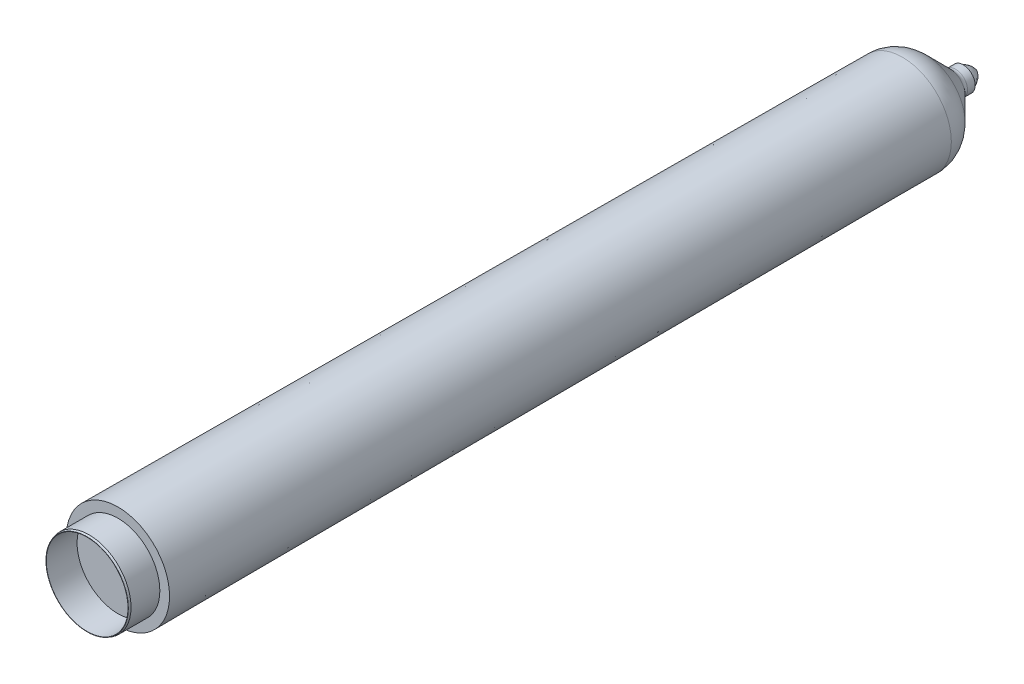
ISO-10303-21;
HEADER;
FILE_DESCRIPTION(('STEP AP214'),'2;1');
FILE_NAME('part.step','',(''),(''),'','','');
FILE_SCHEMA(('AUTOMOTIVE_DESIGN { 1 0 10303 214 1 1 1 1 }'));
ENDSEC;
DATA;
#1=APPLICATION_CONTEXT('core data for automotive mechanical design processes');
#2=APPLICATION_PROTOCOL_DEFINITION('international standard','automotive_design',2000,#1);
#3=PRODUCT_CONTEXT('',#1,'mechanical');
#4=PRODUCT('Part','Part','',(#3));
#5=PRODUCT_RELATED_PRODUCT_CATEGORY('part','',(#4));
#6=PRODUCT_DEFINITION_FORMATION('','',#4);
#7=PRODUCT_DEFINITION_CONTEXT('part definition',#1,'design');
#8=PRODUCT_DEFINITION('design','',#6,#7);
#9=PRODUCT_DEFINITION_SHAPE('','',#8);
#10=(LENGTH_UNIT() NAMED_UNIT(*) SI_UNIT(.MILLI.,.METRE.));
#11=(NAMED_UNIT(*) PLANE_ANGLE_UNIT() SI_UNIT($,.RADIAN.));
#12=(NAMED_UNIT(*) SI_UNIT($,.STERADIAN.) SOLID_ANGLE_UNIT());
#13=UNCERTAINTY_MEASURE_WITH_UNIT(LENGTH_MEASURE(1.E-05),#10,'distance_accuracy_value','');
#14=(GEOMETRIC_REPRESENTATION_CONTEXT(3) GLOBAL_UNCERTAINTY_ASSIGNED_CONTEXT((#13)) GLOBAL_UNIT_ASSIGNED_CONTEXT((#10,
#11,#12)) REPRESENTATION_CONTEXT('',''));
#15=CARTESIAN_POINT('',(0.,0.,0.));
#16=DIRECTION('',(0.,0.,1.));
#17=DIRECTION('',(1.,0.,0.));
#18=AXIS2_PLACEMENT_3D('',#15,#16,#17);
#19=CARTESIAN_POINT('',(0.,0.,-126.14));
#20=DIRECTION('',(0.,0.,1.));
#21=DIRECTION('',(1.,0.,0.));
#22=AXIS2_PLACEMENT_3D('',#19,#20,#21);
#23=PLANE('',#22);
#24=CARTESIAN_POINT('',(0.,0.,-126.14));
#25=DIRECTION('',(0.,0.,-1.));
#26=DIRECTION('',(-1.,0.,0.));
#27=AXIS2_PLACEMENT_3D('',#24,#25,#26);
#28=CIRCLE('',#27,1.57989692160063);
#29=CARTESIAN_POINT('',(-1.57989692160063,0.,-126.14));
#30=VERTEX_POINT('',#29);
#31=EDGE_CURVE('E12',#30,#30,#28,.T.);
#32=ORIENTED_EDGE('',*,*,#31,.F.);
#33=EDGE_LOOP('',(#32));
#34=FACE_BOUND('',#33,.T.);
#35=ADVANCED_FACE('F49',(#34),#23,.T.);
#36=CARTESIAN_POINT('',(1.34120346941098,0.,-125.456499812998));
#37=DIRECTION('',(0.,-1.,0.));
#38=DIRECTION('',(-1.,0.,0.));
#39=AXIS2_PLACEMENT_3D('',#36,#37,#38);
#40=CIRCLE('',#39,3.);
#41=TRIMMED_CURVE('',#40,(PARAMETER_VALUE(-1.10731168961127)),
(PARAMETER_VALUE(1.10731168961127)),.T.,.PARAMETER.);
#42=CARTESIAN_POINT('',(0.,0.,-125.456499812998));
#43=DIRECTION('',(0.,0.,-1.));
#44=AXIS1_PLACEMENT('',#42,#43);
#45=SURFACE_OF_REVOLUTION('',#41,#44);
#46=ORIENTED_EDGE('',*,*,#31,.T.);
#47=EDGE_LOOP('',(#46));
#48=FACE_BOUND('',#47,.T.);
#49=CARTESIAN_POINT('',(0.,0.,-128.14));
#50=VERTEX_POINT('',#49);
#51=VERTEX_LOOP('',#50);
#52=FACE_BOUND('',#51,.T.);
#53=ADVANCED_FACE('F56',(#48,#52),#45,.T.);
#54=CLOSED_SHELL('',(#35,#53));
#55=MANIFOLD_SOLID_BREP('B2',#54);
#56=CARTESIAN_POINT('',(0.,0.,0.));
#57=DIRECTION('',(0.,0.,1.));
#58=DIRECTION('',(1.,0.,0.));
#59=AXIS2_PLACEMENT_3D('',#56,#57,#58);
#60=CONICAL_SURFACE('',#59,7.7,0.00349065850398867);
#61=CARTESIAN_POINT('',(0.,0.,-117.074097526226));
#62=DIRECTION('',(0.,0.,-1.));
#63=DIRECTION('',(0.,1.,0.));
#64=AXIS2_PLACEMENT_3D('',#61,#62,#63);
#65=CIRCLE('',#64,7.29133264604267);
#66=CARTESIAN_POINT('',(0.,7.29133264604267,-117.074097526226));
#67=VERTEX_POINT('',#66);
#68=EDGE_CURVE('E88',#67,#67,#65,.F.);
#69=ORIENTED_EDGE('',*,*,#68,.T.);
#70=EDGE_LOOP('',(#69));
#71=FACE_BOUND('',#70,.T.);
#72=CARTESIAN_POINT('',(0.,0.,0.));
#73=DIRECTION('',(0.,0.,1.));
#74=DIRECTION('',(1.,0.,0.));
#75=AXIS2_PLACEMENT_3D('',#72,#73,#74);
#76=CIRCLE('',#75,7.7);
#77=CARTESIAN_POINT('',(7.7,0.,0.));
#78=VERTEX_POINT('',#77);
#79=EDGE_CURVE('E110',#78,#78,#76,.T.);
#80=ORIENTED_EDGE('',*,*,#79,.F.);
#81=EDGE_LOOP('',(#80));
#82=FACE_BOUND('',#81,.T.);
#83=ADVANCED_FACE('F81',(#71,#82),#60,.T.);
#84=CARTESIAN_POINT('',(0.,0.,0.));
#85=DIRECTION('',(0.,0.,1.));
#86=DIRECTION('',(1.,0.,0.));
#87=AXIS2_PLACEMENT_3D('',#84,#85,#86);
#88=PLANE('',#87);
#89=CARTESIAN_POINT('',(0.,0.,0.));
#90=DIRECTION('',(0.,0.,1.));
#91=DIRECTION('',(1.,0.,0.));
#92=AXIS2_PLACEMENT_3D('',#89,#90,#91);
#93=CIRCLE('',#92,6.25);
#94=CARTESIAN_POINT('',(6.25,0.,0.));
#95=VERTEX_POINT('',#94);
#96=EDGE_CURVE('E113',#95,#95,#93,.T.);
#97=ORIENTED_EDGE('',*,*,#96,.F.);
#98=EDGE_LOOP('',(#97));
#99=FACE_BOUND('',#98,.T.);
#100=ORIENTED_EDGE('',*,*,#79,.T.);
#101=EDGE_LOOP('',(#100));
#102=FACE_BOUND('',#101,.T.);
#103=ADVANCED_FACE('F149',(#99,#102),#88,.T.);
#104=CARTESIAN_POINT('',(0.,0.,4.6));
#105=DIRECTION('',(0.,0.,1.));
#106=DIRECTION('',(1.,0.,0.));
#107=AXIS2_PLACEMENT_3D('',#104,#105,#106);
#108=PLANE('',#107);
#109=CARTESIAN_POINT('',(0.,0.,4.6));
#110=DIRECTION('',(0.,0.,1.));
#111=DIRECTION('',(1.,0.,0.));
#112=AXIS2_PLACEMENT_3D('',#109,#110,#111);
#113=CIRCLE('',#112,6.15000000000003);
#114=CARTESIAN_POINT('',(6.15000000000003,0.,4.6));
#115=VERTEX_POINT('',#114);
#116=EDGE_CURVE('E104',#115,#115,#113,.T.);
#117=ORIENTED_EDGE('',*,*,#116,.T.);
#118=EDGE_LOOP('',(#117));
#119=FACE_BOUND('',#118,.T.);
#120=CARTESIAN_POINT('',(0.,0.,4.6));
#121=DIRECTION('',(0.,0.,1.));
#122=DIRECTION('',(1.,0.,0.));
#123=AXIS2_PLACEMENT_3D('',#120,#121,#122);
#124=CIRCLE('',#123,6.1);
#125=CARTESIAN_POINT('',(6.1,0.,4.6));
#126=VERTEX_POINT('',#125);
#127=EDGE_CURVE('E116',#126,#126,#124,.T.);
#128=ORIENTED_EDGE('',*,*,#127,.F.);
#129=EDGE_LOOP('',(#128));
#130=FACE_BOUND('',#129,.T.);
#131=ADVANCED_FACE('F154',(#119,#130),#108,.T.);
#132=CARTESIAN_POINT('',(0.,0.,4.6));
#133=DIRECTION('',(0.,0.,-1.));
#134=DIRECTION('',(-1.,0.,0.));
#135=AXIS2_PLACEMENT_3D('',#132,#133,#134);
#136=CYLINDRICAL_SURFACE('',#135,6.25);
#137=CARTESIAN_POINT('',(0.,0.,4.30000000000011));
#138=DIRECTION('',(0.,0.,1.));
#139=DIRECTION('',(1.,0.,0.));
#140=AXIS2_PLACEMENT_3D('',#137,#138,#139);
#141=CIRCLE('',#140,6.25);
#142=CARTESIAN_POINT('',(6.25,0.,4.30000000000011));
#143=VERTEX_POINT('',#142);
#144=EDGE_CURVE('E101',#143,#143,#141,.F.);
#145=ORIENTED_EDGE('',*,*,#144,.T.);
#146=EDGE_LOOP('',(#145));
#147=FACE_BOUND('',#146,.T.);
#148=ORIENTED_EDGE('',*,*,#96,.T.);
#149=EDGE_LOOP('',(#148));
#150=FACE_BOUND('',#149,.T.);
#151=ADVANCED_FACE('F232',(#147,#150),#136,.T.);
#152=CARTESIAN_POINT('',(0.,0.,4.6));
#153=DIRECTION('',(0.,0.,-1.));
#154=DIRECTION('',(-1.,0.,0.));
#155=AXIS2_PLACEMENT_3D('',#152,#153,#154);
#156=CYLINDRICAL_SURFACE('',#155,6.1);
#157=ORIENTED_EDGE('',*,*,#127,.T.);
#158=EDGE_LOOP('',(#157));
#159=FACE_BOUND('',#158,.T.);
#160=CARTESIAN_POINT('',(0.,0.,0.));
#161=DIRECTION('',(0.,0.,1.));
#162=DIRECTION('',(1.,0.,0.));
#163=AXIS2_PLACEMENT_3D('',#160,#161,#162);
#164=CIRCLE('',#163,6.1);
#165=CARTESIAN_POINT('',(6.1,0.,0.));
#166=VERTEX_POINT('',#165);
#167=EDGE_CURVE('E107',#166,#166,#164,.F.);
#168=ORIENTED_EDGE('',*,*,#167,.T.);
#169=EDGE_LOOP('',(#168));
#170=FACE_BOUND('',#169,.T.);
#171=ADVANCED_FACE('F237',(#159,#170),#156,.F.);
#172=ORIENTED_EDGE('',*,*,#167,.F.);
#173=EDGE_LOOP('',(#172));
#174=FACE_BOUND('',#173,.T.);
#175=ADVANCED_FACE('F156',(#174),#88,.T.);
#176=CARTESIAN_POINT('',(0.,0.,4.6));
#177=DIRECTION('',(0.,0.,-1.));
#178=DIRECTION('',(-1.,0.,0.));
#179=AXIS2_PLACEMENT_3D('',#176,#177,#178);
#180=CONICAL_SURFACE('',#179,6.15000000000003,0.321750554396658);
#181=ORIENTED_EDGE('',*,*,#144,.F.);
#182=EDGE_LOOP('',(#181));
#183=FACE_BOUND('',#182,.T.);
#184=ORIENTED_EDGE('',*,*,#116,.F.);
#185=EDGE_LOOP('',(#184));
#186=FACE_BOUND('',#185,.T.);
#187=ADVANCED_FACE('F143',(#183,#186),#180,.T.);
#188=CARTESIAN_POINT('',(0.,0.,-124.14));
#189=DIRECTION('',(0.,0.,1.));
#190=DIRECTION('',(0.,-1.,0.));
#191=AXIS2_PLACEMENT_3D('',#188,#189,#190);
#192=CYLINDRICAL_SURFACE('',#191,1.77989692160063);
#193=CARTESIAN_POINT('',(0.,0.,-124.998263849908));
#194=DIRECTION('',(0.,0.,1.));
#195=DIRECTION('',(0.,-1.,0.));
#196=AXIS2_PLACEMENT_3D('',#193,#194,#195);
#197=CIRCLE('',#196,1.77989692160063);
#198=CARTESIAN_POINT('',(0.,-1.77989692160063,-124.998263849908));
#199=VERTEX_POINT('',#198);
#200=EDGE_CURVE('E92',#199,#199,#197,.F.);
#201=ORIENTED_EDGE('',*,*,#200,.T.);
#202=EDGE_LOOP('',(#201));
#203=FACE_BOUND('',#202,.T.);
#204=CARTESIAN_POINT('',(0.,0.,-126.14));
#205=DIRECTION('',(0.,0.,1.));
#206=DIRECTION('',(0.,-1.,0.));
#207=AXIS2_PLACEMENT_3D('',#204,#205,#206);
#208=CIRCLE('',#207,1.77989692160063);
#209=CARTESIAN_POINT('',(0.,-1.77989692160063,-126.14));
#210=VERTEX_POINT('',#209);
#211=EDGE_CURVE('E125',#210,#210,#208,.T.);
#212=ORIENTED_EDGE('',*,*,#211,.T.);
#213=EDGE_LOOP('',(#212));
#214=FACE_BOUND('',#213,.T.);
#215=ADVANCED_FACE('F129',(#203,#214),#192,.T.);
#216=CARTESIAN_POINT('',(0.,0.,-126.14));
#217=DIRECTION('',(0.,0.,1.));
#218=DIRECTION('',(1.,0.,0.));
#219=AXIS2_PLACEMENT_3D('',#216,#217,#218);
#220=PLANE('',#219);
#221=CARTESIAN_POINT('',(0.,0.,-126.14));
#222=DIRECTION('',(0.,0.,1.));
#223=DIRECTION('',(0.,-1.,0.));
#224=AXIS2_PLACEMENT_3D('',#221,#222,#223);
#225=CIRCLE('',#224,1.57989692160063);
#226=CARTESIAN_POINT('',(0.,-1.57989692160063,-126.14));
#227=VERTEX_POINT('',#226);
#228=EDGE_CURVE('E119',#227,#227,#225,.T.);
#229=ORIENTED_EDGE('',*,*,#228,.T.);
#230=EDGE_LOOP('',(#229));
#231=FACE_BOUND('',#230,.T.);
#232=ORIENTED_EDGE('',*,*,#211,.F.);
#233=EDGE_LOOP('',(#232));
#234=FACE_BOUND('',#233,.T.);
#235=ADVANCED_FACE('F131',(#231,#234),#220,.F.);
#236=CARTESIAN_POINT('',(0.,0.,-124.14));
#237=DIRECTION('',(0.,0.,1.));
#238=DIRECTION('',(0.,-1.,0.));
#239=AXIS2_PLACEMENT_3D('',#236,#237,#238);
#240=CYLINDRICAL_SURFACE('',#239,1.57989692160063);
#241=CARTESIAN_POINT('',(0.,0.,-124.14));
#242=DIRECTION('',(0.,0.,1.));
#243=DIRECTION('',(0.,-1.,0.));
#244=AXIS2_PLACEMENT_3D('',#241,#242,#243);
#245=CIRCLE('',#244,1.57989692160063);
#246=CARTESIAN_POINT('',(0.,-1.57989692160063,-124.14));
#247=VERTEX_POINT('',#246);
#248=EDGE_CURVE('E122',#247,#247,#245,.T.);
#249=ORIENTED_EDGE('',*,*,#248,.T.);
#250=EDGE_LOOP('',(#249));
#251=FACE_BOUND('',#250,.T.);
#252=ORIENTED_EDGE('',*,*,#228,.F.);
#253=EDGE_LOOP('',(#252));
#254=FACE_BOUND('',#253,.T.);
#255=ADVANCED_FACE('F133',(#251,#254),#240,.F.);
#256=CARTESIAN_POINT('',(0.,0.,-124.14));
#257=DIRECTION('',(0.,0.,-1.));
#258=DIRECTION('',(0.,1.,0.));
#259=AXIS2_PLACEMENT_3D('',#256,#257,#258);
#260=PLANE('',#259);
#261=ORIENTED_EDGE('',*,*,#248,.F.);
#262=EDGE_LOOP('',(#261));
#263=FACE_BOUND('',#262,.T.);
#264=ADVANCED_FACE('F140',(#263),#260,.T.);
#265=CARTESIAN_POINT('',(0.,0.,-119.140042646395));
#266=DIRECTION('',(0.,0.,1.));
#267=DIRECTION('',(0.,-1.,0.));
#268=AXIS2_PLACEMENT_3D('',#265,#266,#267);
#269=CONICAL_SURFACE('',#268,7.28412110785001,0.787143492649446);
#270=CARTESIAN_POINT('',(0.,0.,-120.598343457773));
#271=DIRECTION('',(0.,0.,-1.));
#272=DIRECTION('',(0.,1.,0.));
#273=AXIS2_PLACEMENT_3D('',#270,#271,#272);
#274=CIRCLE('',#273,5.82072096114711);
#275=CARTESIAN_POINT('',(0.,5.82072096114711,-120.598343457773));
#276=VERTEX_POINT('',#275);
#277=EDGE_CURVE('E48',#276,#276,#274,.T.);
#278=ORIENTED_EDGE('',*,*,#277,.T.);
#279=EDGE_LOOP('',(#278));
#280=FACE_BOUND('',#279,.T.);
#281=CARTESIAN_POINT('',(0.,0.,-124.140012184684));
#282=DIRECTION('',(0.,0.,1.));
#283=DIRECTION('',(0.,-1.,0.));
#284=AXIS2_PLACEMENT_3D('',#281,#282,#283);
#285=CIRCLE('',#284,2.26666785077384);
#286=CARTESIAN_POINT('',(0.,-2.26666785077384,-124.140012184684));
#287=VERTEX_POINT('',#286);
#288=EDGE_CURVE('E96',#287,#287,#285,.F.);
#289=ORIENTED_EDGE('',*,*,#288,.F.);
#290=EDGE_LOOP('',(#289));
#291=FACE_BOUND('',#290,.T.);
#292=ADVANCED_FACE('F166',(#280,#291),#269,.T.);
#293=CARTESIAN_POINT('',(0.,0.,-124.998263849908));
#294=DIRECTION('',(0.,0.,1.));
#295=DIRECTION('',(0.,-1.,0.));
#296=AXIS2_PLACEMENT_3D('',#293,#294,#295);
#297=TOROIDAL_SURFACE('',#296,2.77989692160063,1.);
#298=ORIENTED_EDGE('',*,*,#200,.F.);
#299=EDGE_LOOP('',(#298));
#300=FACE_BOUND('',#299,.T.);
#301=ORIENTED_EDGE('',*,*,#288,.T.);
#302=EDGE_LOOP('',(#301));
#303=FACE_BOUND('',#302,.T.);
#304=ADVANCED_FACE('F170',(#300,#303),#297,.F.);
#305=CARTESIAN_POINT('',(0.,0.,-117.05664426915));
#306=DIRECTION('',(0.,0.,-1.));
#307=DIRECTION('',(0.,1.,0.));
#308=AXIS2_PLACEMENT_3D('',#305,#306,#307);
#309=DEGENERATE_TOROIDAL_SURFACE('',#308,2.29136310775371,5.,.T.);
#310=ORIENTED_EDGE('',*,*,#277,.F.);
#311=EDGE_LOOP('',(#310));
#312=FACE_BOUND('',#311,.T.);
#313=ORIENTED_EDGE('',*,*,#68,.F.);
#314=EDGE_LOOP('',(#313));
#315=FACE_BOUND('',#314,.T.);
#316=ADVANCED_FACE('F83',(#312,#315),#309,.T.);
#317=CLOSED_SHELL('',(#83,#103,#131,#151,#171,#175,#187,#215,#235,#255,#264,#292,#304,#316));
#318=MANIFOLD_SOLID_BREP('B6',#317);
#319=ADVANCED_BREP_SHAPE_REPRESENTATION('',(#18,#55,#318),#14);
#320=SHAPE_DEFINITION_REPRESENTATION(#9,#319);
ENDSEC;
END-ISO-10303-21;
